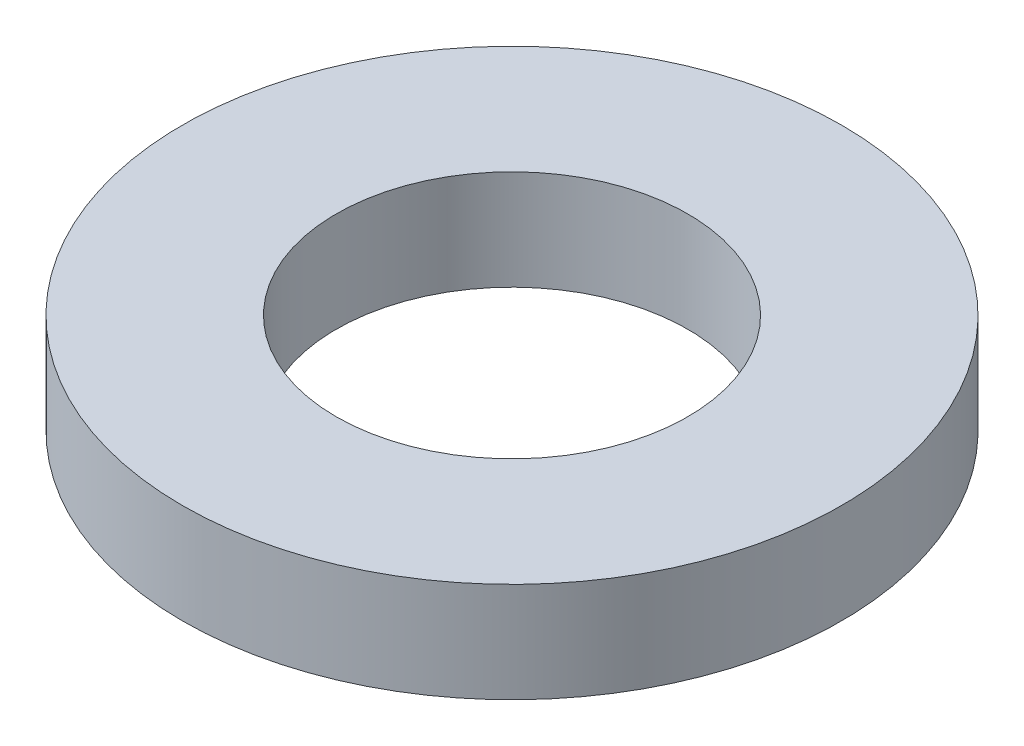
ISO-10303-21;
HEADER;
FILE_DESCRIPTION(('STEP AP214'),'2;1');
FILE_NAME('part.step','',(''),(''),'','','');
FILE_SCHEMA(('AUTOMOTIVE_DESIGN { 1 0 10303 214 1 1 1 1 }'));
ENDSEC;
DATA;
#1=APPLICATION_CONTEXT('core data for automotive mechanical design processes');
#2=APPLICATION_PROTOCOL_DEFINITION('international standard','automotive_design',2000,#1);
#3=PRODUCT_CONTEXT('',#1,'mechanical');
#4=PRODUCT('Part','Part','',(#3));
#5=PRODUCT_RELATED_PRODUCT_CATEGORY('part','',(#4));
#6=PRODUCT_DEFINITION_FORMATION('','',#4);
#7=PRODUCT_DEFINITION_CONTEXT('part definition',#1,'design');
#8=PRODUCT_DEFINITION('design','',#6,#7);
#9=PRODUCT_DEFINITION_SHAPE('','',#8);
#10=(LENGTH_UNIT() NAMED_UNIT(*) SI_UNIT(.MILLI.,.METRE.));
#11=(NAMED_UNIT(*) PLANE_ANGLE_UNIT() SI_UNIT($,.RADIAN.));
#12=(NAMED_UNIT(*) SI_UNIT($,.STERADIAN.) SOLID_ANGLE_UNIT());
#13=UNCERTAINTY_MEASURE_WITH_UNIT(LENGTH_MEASURE(1.E-05),#10,'distance_accuracy_value','');
#14=(GEOMETRIC_REPRESENTATION_CONTEXT(3) GLOBAL_UNCERTAINTY_ASSIGNED_CONTEXT((#13)) GLOBAL_UNIT_ASSIGNED_CONTEXT((#10,
#11,#12)) REPRESENTATION_CONTEXT('',''));
#15=CARTESIAN_POINT('',(0.,0.,0.));
#16=DIRECTION('',(0.,0.,1.));
#17=DIRECTION('',(1.,0.,0.));
#18=AXIS2_PLACEMENT_3D('',#15,#16,#17);
#19=CARTESIAN_POINT('',(0.,3.609975,0.));
#20=DIRECTION('',(0.,1.,0.));
#21=DIRECTION('',(0.,0.,1.));
#22=AXIS2_PLACEMENT_3D('',#19,#20,#21);
#23=PLANE('',#22);
#24=CARTESIAN_POINT('',(0.,3.609975,0.));
#25=DIRECTION('',(0.,1.,0.));
#26=DIRECTION('',(0.,0.,1.));
#27=AXIS2_PLACEMENT_3D('',#24,#25,#26);
#28=CIRCLE('',#27,11.90625);
#29=CARTESIAN_POINT('',(0.,3.609975,11.90625));
#30=VERTEX_POINT('',#29);
#31=EDGE_CURVE('E10',#30,#30,#28,.T.);
#32=ORIENTED_EDGE('',*,*,#31,.T.);
#33=EDGE_LOOP('',(#32));
#34=FACE_BOUND('',#33,.T.);
#35=CARTESIAN_POINT('',(0.,3.609975,0.));
#36=DIRECTION('',(0.,1.,0.));
#37=DIRECTION('',(0.,0.,1.));
#38=AXIS2_PLACEMENT_3D('',#35,#36,#37);
#39=CIRCLE('',#38,6.35);
#40=CARTESIAN_POINT('',(0.,3.609975,6.35));
#41=VERTEX_POINT('',#40);
#42=EDGE_CURVE('E42',#41,#41,#39,.T.);
#43=ORIENTED_EDGE('',*,*,#42,.F.);
#44=EDGE_LOOP('',(#43));
#45=FACE_BOUND('',#44,.T.);
#46=ADVANCED_FACE('F31',(#34,#45),#23,.T.);
#47=CARTESIAN_POINT('',(0.,0.,0.));
#48=DIRECTION('',(0.,1.,0.));
#49=DIRECTION('',(0.,0.,1.));
#50=AXIS2_PLACEMENT_3D('',#47,#48,#49);
#51=PLANE('',#50);
#52=CARTESIAN_POINT('',(0.,0.,0.));
#53=DIRECTION('',(0.,1.,0.));
#54=DIRECTION('',(0.,0.,1.));
#55=AXIS2_PLACEMENT_3D('',#52,#53,#54);
#56=CIRCLE('',#55,11.90625);
#57=CARTESIAN_POINT('',(0.,0.,11.90625));
#58=VERTEX_POINT('',#57);
#59=EDGE_CURVE('E35',#58,#58,#56,.T.);
#60=ORIENTED_EDGE('',*,*,#59,.F.);
#61=EDGE_LOOP('',(#60));
#62=FACE_BOUND('',#61,.T.);
#63=CARTESIAN_POINT('',(0.,0.,0.));
#64=DIRECTION('',(0.,1.,0.));
#65=DIRECTION('',(0.,0.,1.));
#66=AXIS2_PLACEMENT_3D('',#63,#64,#65);
#67=CIRCLE('',#66,6.35);
#68=CARTESIAN_POINT('',(0.,0.,6.35));
#69=VERTEX_POINT('',#68);
#70=EDGE_CURVE('E44',#69,#69,#67,.T.);
#71=ORIENTED_EDGE('',*,*,#70,.T.);
#72=EDGE_LOOP('',(#71));
#73=FACE_BOUND('',#72,.T.);
#74=ADVANCED_FACE('F54',(#62,#73),#51,.F.);
#75=CARTESIAN_POINT('',(0.,3.609975,0.));
#76=DIRECTION('',(0.,-1.,0.));
#77=DIRECTION('',(0.,0.,-1.));
#78=AXIS2_PLACEMENT_3D('',#75,#76,#77);
#79=CYLINDRICAL_SURFACE('',#78,11.90625);
#80=ORIENTED_EDGE('',*,*,#31,.F.);
#81=EDGE_LOOP('',(#80));
#82=FACE_BOUND('',#81,.T.);
#83=ORIENTED_EDGE('',*,*,#59,.T.);
#84=EDGE_LOOP('',(#83));
#85=FACE_BOUND('',#84,.T.);
#86=ADVANCED_FACE('F33',(#82,#85),#79,.T.);
#87=CARTESIAN_POINT('',(0.,3.609975,0.));
#88=DIRECTION('',(0.,-1.,0.));
#89=DIRECTION('',(0.,0.,-1.));
#90=AXIS2_PLACEMENT_3D('',#87,#88,#89);
#91=CYLINDRICAL_SURFACE('',#90,6.35);
#92=ORIENTED_EDGE('',*,*,#42,.T.);
#93=EDGE_LOOP('',(#92));
#94=FACE_BOUND('',#93,.T.);
#95=ORIENTED_EDGE('',*,*,#70,.F.);
#96=EDGE_LOOP('',(#95));
#97=FACE_BOUND('',#96,.T.);
#98=ADVANCED_FACE('F50',(#94,#97),#91,.F.);
#99=CLOSED_SHELL('',(#46,#74,#86,#98));
#100=MANIFOLD_SOLID_BREP('B2',#99);
#101=ADVANCED_BREP_SHAPE_REPRESENTATION('',(#18,#100),#14);
#102=SHAPE_DEFINITION_REPRESENTATION(#9,#101);
ENDSEC;
END-ISO-10303-21;
